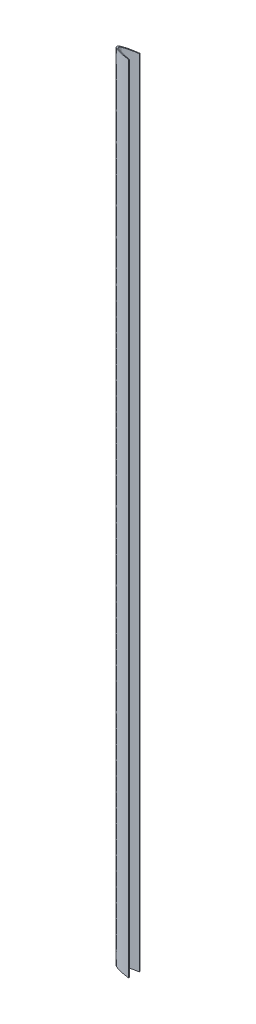
ISO-10303-21;
HEADER;
FILE_DESCRIPTION(('STEP AP214'),'2;1');
FILE_NAME('part.step','',(''),(''),'','','');
FILE_SCHEMA(('AUTOMOTIVE_DESIGN { 1 0 10303 214 1 1 1 1 }'));
ENDSEC;
DATA;
#1=APPLICATION_CONTEXT('core data for automotive mechanical design processes');
#2=APPLICATION_PROTOCOL_DEFINITION('international standard','automotive_design',2000,#1);
#3=PRODUCT_CONTEXT('',#1,'mechanical');
#4=PRODUCT('Part','Part','',(#3));
#5=PRODUCT_RELATED_PRODUCT_CATEGORY('part','',(#4));
#6=PRODUCT_DEFINITION_FORMATION('','',#4);
#7=PRODUCT_DEFINITION_CONTEXT('part definition',#1,'design');
#8=PRODUCT_DEFINITION('design','',#6,#7);
#9=PRODUCT_DEFINITION_SHAPE('','',#8);
#10=(LENGTH_UNIT() NAMED_UNIT(*) SI_UNIT(.MILLI.,.METRE.));
#11=(NAMED_UNIT(*) PLANE_ANGLE_UNIT() SI_UNIT($,.RADIAN.));
#12=(NAMED_UNIT(*) SI_UNIT($,.STERADIAN.) SOLID_ANGLE_UNIT());
#13=UNCERTAINTY_MEASURE_WITH_UNIT(LENGTH_MEASURE(1.E-05),#10,'distance_accuracy_value','');
#14=(GEOMETRIC_REPRESENTATION_CONTEXT(3) GLOBAL_UNCERTAINTY_ASSIGNED_CONTEXT((#13)) GLOBAL_UNIT_ASSIGNED_CONTEXT((#10,
#11,#12)) REPRESENTATION_CONTEXT('',''));
#15=CARTESIAN_POINT('',(0.,0.,0.));
#16=DIRECTION('',(0.,0.,1.));
#17=DIRECTION('',(1.,0.,0.));
#18=AXIS2_PLACEMENT_3D('',#15,#16,#17);
#19=CARTESIAN_POINT('',(189.415540071674,2000.,-1.46822710375217E-09));
#20=CARTESIAN_POINT('',(189.415509922383,2000.,-0.0373090774492106));
#21=CARTESIAN_POINT('',(187.234443709608,2000.,-0.185804178699002));
#22=CARTESIAN_POINT('',(185.009597589198,2000.,-0.522010603287973));
#23=CARTESIAN_POINT('',(180.540141212634,2000.,-1.07886918522139));
#24=CARTESIAN_POINT('',(175.979551932322,2000.,-2.00675916470342));
#25=CARTESIAN_POINT('',(169.923409393147,2000.,-3.42098479383916));
#26=CARTESIAN_POINT('',(162.292974670485,2000.,-5.28550112282938));
#27=CARTESIAN_POINT('',(153.26740712622,2000.,-7.61149253657733));
#28=CARTESIAN_POINT('',(144.244834339226,2000.,-9.87821380777125));
#29=CARTESIAN_POINT('',(135.21533799998,2000.,-11.968697988892));
#30=CARTESIAN_POINT('',(126.183269777046,2000.,-13.7603779795983));
#31=CARTESIAN_POINT('',(117.145069850987,2000.,-15.1633903003828));
#32=CARTESIAN_POINT('',(108.080251691055,2000.,-15.8345922202119));
#33=CARTESIAN_POINT('',(99.0364826373914,2000.,-16.2111416336134));
#34=CARTESIAN_POINT('',(89.9939333087765,2000.,-16.304571008796));
#35=CARTESIAN_POINT('',(80.9524002611325,2000.,-16.1623627831159));
#36=CARTESIAN_POINT('',(71.9106308540781,2000.,-15.7694412636075));
#37=CARTESIAN_POINT('',(62.8686421205967,2000.,-15.1279586655848));
#38=CARTESIAN_POINT('',(53.8245676436083,2000.,-14.2332421104154));
#39=CARTESIAN_POINT('',(44.7772746253797,2000.,-13.0460941768475));
#40=CARTESIAN_POINT('',(35.7197361057067,2000.,-11.5181357892432));
#41=CARTESIAN_POINT('',(28.1878138078091,2000.,-9.85311589432562));
#42=CARTESIAN_POINT('',(22.1769239605998,2000.,-8.18311409057811));
#43=CARTESIAN_POINT('',(17.6236293429938,2000.,-6.7114399364518));
#44=CARTESIAN_POINT('',(13.8437490033737,2000.,-5.16613162965056));
#45=CARTESIAN_POINT('',(11.2881346524485,2000.,-3.83325580592086));
#46=CARTESIAN_POINT('',(10.1187787372071,2000.,-2.96337889699919));
#47=CARTESIAN_POINT('',(9.38182237589285,2000.,-2.24956855700115));
#48=CARTESIAN_POINT('',(8.79999511200732,2000.,-1.30911098047793));
#49=CARTESIAN_POINT('',(8.57456595441904,2000.,1.30707810380218E-07));
#50=CARTESIAN_POINT('',(8.79999511392495,2000.,1.30911124156406));
#51=CARTESIAN_POINT('',(9.38182237918238,2000.,2.2495688172365));
#52=CARTESIAN_POINT('',(10.1187787415387,2000.,2.96337915615731));
#53=CARTESIAN_POINT('',(11.28813465805,2000.,3.83325606336938));
#54=CARTESIAN_POINT('',(13.8437490109283,2000.,5.16613188336316));
#55=CARTESIAN_POINT('',(17.6236293528016,2000.,6.7114401846392));
#56=CARTESIAN_POINT('',(22.1769239725582,2000.,8.18311433210913));
#57=CARTESIAN_POINT('',(28.1878138222133,2000.,9.85311612707132));
#58=CARTESIAN_POINT('',(35.7197361225358,2000.,11.5181360109671));
#59=CARTESIAN_POINT('',(44.7772746444777,2000.,13.0460943853815));
#60=CARTESIAN_POINT('',(53.8245676642928,2000.,14.2332423055379));
#61=CARTESIAN_POINT('',(62.8686421431529,2000.,15.1279588481782));
#62=CARTESIAN_POINT('',(71.9106308754901,2000.,15.7694414304118));
#63=CARTESIAN_POINT('',(80.9524002908713,2000.,16.1623629462799));
#64=CARTESIAN_POINT('',(89.9939333098195,2000.,16.3045711230417));
#65=CARTESIAN_POINT('',(99.0364827461727,2000.,16.2111418678867));
#66=CARTESIAN_POINT('',(108.08025139604,2000.,15.8345919431857));
#67=CARTESIAN_POINT('',(117.145071067495,2000.,15.1633918783438));
#68=CARTESIAN_POINT('',(126.183265287344,2000.,13.760372498588));
#69=CARTESIAN_POINT('',(135.215355049157,2000.,11.9687191026734));
#70=CARTESIAN_POINT('',(144.244770230589,2000.,9.87813466618072));
#71=CARTESIAN_POINT('',(153.267647716944,2000.,7.61178974984193));
#72=CARTESIAN_POINT('',(160.855089756957,2000.,5.65499039696558));
#73=CARTESIAN_POINT('',(166.875765087628,2000.,4.16754081835265));
#74=CARTESIAN_POINT('',(172.918491011001,2000.,2.71827606712224));
#75=CARTESIAN_POINT('',(178.782189930716,2000.,1.30435274576959));
#76=CARTESIAN_POINT('',(185.004045816921,2000.,0.521946489415346));
#77=CARTESIAN_POINT('',(187.234744008161,2000.,0.185808596921332));
#78=CARTESIAN_POINT('',(189.415570220964,2000.,0.0373090745127584));
#79=CARTESIAN_POINT('',(189.415540071674,2000.,-1.46822710375217E-09));
#80=B_SPLINE_CURVE_WITH_KNOTS('',3,(#19,#20,#21,#22,#23,#24,#25,#26,#27,#28,#29,#30,#31,#32,#33,
#34,#35,#36,#37,#38,#39,#40,#41,#42,#43,#44,#45,#46,#47,#48,#49,#50,#51,#52,#53,#54,#55,#56,#57,
#58,#59,#60,#61,#62,#63,#64,#65,#66,#67,#68,#69,#70,#71,#72,#73,#74,#75,#76,#77,#78,#79),
.UNSPECIFIED.,.T.,.F.,(4,1,1,1,1,1,1,1,1,1,1,1,1,1,1,1,1,1,1,1,1,1,1,1,1,1,1,1,1,1,1,1,1,1,1,1,
1,1,1,1,1,1,1,1,1,1,1,1,1,1,1,1,1,1,1,1,1,1,4),(0.,0.00275960006435719,0.0109837400285537,
0.0244798522244805,0.0359107304847873,0.0493053709513717,0.0742942270255699,0.0993429784245328,
0.124359733109855,0.149264718616297,0.174009696202119,0.198546973902352,0.222903969528019,
0.247200685918746,0.271477726499725,0.295756351635428,0.320054721145611,0.344391348740664,
0.368786978174677,0.393273071252745,0.417900952231735,0.4427812285463,0.455381891196595,
0.46816043628681,0.481314036541433,0.488255537630036,0.491307544737041,0.493017230715351,
0.496509376843066,0.500001654593551,0.503493932344035,0.50698607847175,0.50869576445006,
0.511747771557065,0.518689272645668,0.531842872900291,0.544621417990506,0.557222080640801,
0.582102356955366,0.606730237934356,0.631216331012424,0.655611960446438,0.67994858804149,
0.704246957551673,0.728525582687377,0.752802623268356,0.777099339659083,0.801456335284749,
0.825993612984982,0.850738590570804,0.875643576077246,0.900660330762568,0.925709082161531,
0.938746807311356,0.95069803514192,0.975520147775519,0.989016259971446,0.997240399935643,1.),.UNSPECIFIED.);
#81=DIRECTION('',(0.,-1.,0.));
#82=VECTOR('',#81,1.);
#83=SURFACE_OF_LINEAR_EXTRUSION('',#80,#82);
#84=CARTESIAN_POINT('',(189.415540071674,0.,-1.46822710375217E-09));
#85=CARTESIAN_POINT('',(189.415509922383,0.,-0.0373090774492106));
#86=CARTESIAN_POINT('',(187.234443709608,0.,-0.185804178699002));
#87=CARTESIAN_POINT('',(185.009597589198,0.,-0.522010603287973));
#88=CARTESIAN_POINT('',(180.540141212634,0.,-1.07886918522139));
#89=CARTESIAN_POINT('',(175.979551932322,0.,-2.00675916470342));
#90=CARTESIAN_POINT('',(169.923409393147,0.,-3.42098479383916));
#91=CARTESIAN_POINT('',(162.292974670485,0.,-5.28550112282938));
#92=CARTESIAN_POINT('',(153.26740712622,0.,-7.61149253657733));
#93=CARTESIAN_POINT('',(144.244834339226,0.,-9.87821380777125));
#94=CARTESIAN_POINT('',(135.21533799998,0.,-11.968697988892));
#95=CARTESIAN_POINT('',(126.183269777046,0.,-13.7603779795983));
#96=CARTESIAN_POINT('',(117.145069850987,0.,-15.1633903003828));
#97=CARTESIAN_POINT('',(108.080251691055,0.,-15.8345922202119));
#98=CARTESIAN_POINT('',(99.0364826373914,0.,-16.2111416336134));
#99=CARTESIAN_POINT('',(89.9939333087765,0.,-16.304571008796));
#100=CARTESIAN_POINT('',(80.9524002611325,0.,-16.1623627831159));
#101=CARTESIAN_POINT('',(71.9106308540781,0.,-15.7694412636075));
#102=CARTESIAN_POINT('',(62.8686421205967,0.,-15.1279586655848));
#103=CARTESIAN_POINT('',(53.8245676436083,0.,-14.2332421104154));
#104=CARTESIAN_POINT('',(44.7772746253797,0.,-13.0460941768475));
#105=CARTESIAN_POINT('',(35.7197361057067,0.,-11.5181357892432));
#106=CARTESIAN_POINT('',(28.1878138078091,0.,-9.85311589432562));
#107=CARTESIAN_POINT('',(22.1769239605998,0.,-8.18311409057811));
#108=CARTESIAN_POINT('',(17.6236293429938,0.,-6.7114399364518));
#109=CARTESIAN_POINT('',(13.8437490033737,0.,-5.16613162965056));
#110=CARTESIAN_POINT('',(11.2881346524485,0.,-3.83325580592086));
#111=CARTESIAN_POINT('',(10.1187787372071,0.,-2.96337889699919));
#112=CARTESIAN_POINT('',(9.38182237589285,0.,-2.24956855700115));
#113=CARTESIAN_POINT('',(8.79999511200732,0.,-1.30911098047793));
#114=CARTESIAN_POINT('',(8.57456595441904,0.,1.30707810380218E-07));
#115=CARTESIAN_POINT('',(8.79999511392495,0.,1.30911124156406));
#116=CARTESIAN_POINT('',(9.38182237918238,0.,2.2495688172365));
#117=CARTESIAN_POINT('',(10.1187787415387,0.,2.96337915615731));
#118=CARTESIAN_POINT('',(11.28813465805,0.,3.83325606336938));
#119=CARTESIAN_POINT('',(13.8437490109283,0.,5.16613188336316));
#120=CARTESIAN_POINT('',(17.6236293528016,0.,6.7114401846392));
#121=CARTESIAN_POINT('',(22.1769239725582,0.,8.18311433210913));
#122=CARTESIAN_POINT('',(28.1878138222133,0.,9.85311612707132));
#123=CARTESIAN_POINT('',(35.7197361225358,0.,11.5181360109671));
#124=CARTESIAN_POINT('',(44.7772746444777,0.,13.0460943853815));
#125=CARTESIAN_POINT('',(53.8245676642928,0.,14.2332423055379));
#126=CARTESIAN_POINT('',(62.8686421431529,0.,15.1279588481782));
#127=CARTESIAN_POINT('',(71.9106308754901,0.,15.7694414304118));
#128=CARTESIAN_POINT('',(80.9524002908713,0.,16.1623629462799));
#129=CARTESIAN_POINT('',(89.9939333098195,0.,16.3045711230417));
#130=CARTESIAN_POINT('',(99.0364827461727,0.,16.2111418678867));
#131=CARTESIAN_POINT('',(108.08025139604,0.,15.8345919431857));
#132=CARTESIAN_POINT('',(117.145071067495,0.,15.1633918783438));
#133=CARTESIAN_POINT('',(126.183265287344,0.,13.760372498588));
#134=CARTESIAN_POINT('',(135.215355049157,0.,11.9687191026734));
#135=CARTESIAN_POINT('',(144.244770230589,0.,9.87813466618072));
#136=CARTESIAN_POINT('',(153.267647716944,0.,7.61178974984193));
#137=CARTESIAN_POINT('',(160.855089756957,0.,5.65499039696558));
#138=CARTESIAN_POINT('',(166.875765087628,0.,4.16754081835265));
#139=CARTESIAN_POINT('',(172.918491011001,0.,2.71827606712224));
#140=CARTESIAN_POINT('',(178.782189930716,0.,1.30435274576959));
#141=CARTESIAN_POINT('',(185.004045816921,0.,0.521946489415346));
#142=CARTESIAN_POINT('',(187.234744008161,0.,0.185808596921332));
#143=CARTESIAN_POINT('',(189.415570220964,0.,0.0373090745127584));
#144=CARTESIAN_POINT('',(189.415540071674,0.,-1.46822710375217E-09));
#145=B_SPLINE_CURVE_WITH_KNOTS('',3,(#84,#85,#86,#87,#88,#89,#90,#91,#92,#93,#94,#95,#96,#97,
#98,#99,#100,#101,#102,#103,#104,#105,#106,#107,#108,#109,#110,#111,#112,#113,#114,#115,#116,
#117,#118,#119,#120,#121,#122,#123,#124,#125,#126,#127,#128,#129,#130,#131,#132,#133,#134,#135,
#136,#137,#138,#139,#140,#141,#142,#143,#144),.UNSPECIFIED.,.T.,.F.,(4,1,1,1,1,1,1,1,1,1,1,1,1,
1,1,1,1,1,1,1,1,1,1,1,1,1,1,1,1,1,1,1,1,1,1,1,1,1,1,1,1,1,1,1,1,1,1,1,1,1,1,1,1,1,1,1,1,1,4),
(0.,0.00275960006435719,0.0109837400285537,0.0244798522244805,0.0359107304847873,
0.0493053709513717,0.0742942270255699,0.0993429784245328,0.124359733109855,0.149264718616297,
0.174009696202119,0.198546973902352,0.222903969528019,0.247200685918746,0.271477726499725,
0.295756351635428,0.320054721145611,0.344391348740664,0.368786978174677,0.393273071252745,
0.417900952231735,0.4427812285463,0.455381891196595,0.46816043628681,0.481314036541433,
0.488255537630036,0.491307544737041,0.493017230715351,0.496509376843066,0.500001654593551,
0.503493932344035,0.50698607847175,0.50869576445006,0.511747771557065,0.518689272645668,
0.531842872900291,0.544621417990506,0.557222080640801,0.582102356955366,0.606730237934356,
0.631216331012424,0.655611960446438,0.67994858804149,0.704246957551673,0.728525582687377,
0.752802623268356,0.777099339659083,0.801456335284749,0.825993612984982,0.850738590570804,
0.875643576077246,0.900660330762568,0.925709082161531,0.938746807311356,0.95069803514192,
0.975520147775519,0.989016259971446,0.997240399935643,1.),.UNSPECIFIED.);
#146=CARTESIAN_POINT('',(52.4693522250673,0.,-14.0253387511073));
#147=VERTEX_POINT('',#146);
#148=CARTESIAN_POINT('',(52.4693522089367,0.,14.0253389439368));
#149=VERTEX_POINT('',#148);
#150=EDGE_CURVE('E129',#147,#149,#145,.T.);
#151=ORIENTED_EDGE('',*,*,#150,.T.);
#152=DIRECTION('',(0.,-1.,0.));
#153=VECTOR('',#152,1.);
#154=CARTESIAN_POINT('',(52.4693522089367,2000.,14.0253389439368));
#155=LINE('',#154,#153);
#156=CARTESIAN_POINT('',(52.4693522089367,2000.,14.0253389439368));
#157=VERTEX_POINT('',#156);
#158=EDGE_CURVE('E11',#157,#149,#155,.T.);
#159=ORIENTED_EDGE('',*,*,#158,.F.);
#160=CARTESIAN_POINT('',(52.4693522250673,2000.,-14.0253387511073));
#161=VERTEX_POINT('',#160);
#162=EDGE_CURVE('E90',#161,#157,#80,.T.);
#163=ORIENTED_EDGE('',*,*,#162,.F.);
#164=DIRECTION('',(0.,-1.,0.));
#165=VECTOR('',#164,1.);
#166=CARTESIAN_POINT('',(52.4693522250673,2000.,-14.0253387511073));
#167=LINE('',#166,#165);
#168=EDGE_CURVE('E59',#161,#147,#167,.T.);
#169=ORIENTED_EDGE('',*,*,#168,.T.);
#170=EDGE_LOOP('',(#151,#159,#163,#169));
#171=FACE_BOUND('',#170,.T.);
#172=ADVANCED_FACE('F41',(#171),#83,.F.);
#173=CARTESIAN_POINT('',(53.3899385658946,2000.,6.84688623850483));
#174=DIRECTION('',(0.991876925143201,0.,0.127201278957675));
#175=DIRECTION('',(0.127201278957675,0.,-0.991876925143201));
#176=AXIS2_PLACEMENT_3D('',#173,#174,#175);
#177=PLANE('',#176);
#178=DIRECTION('',(-0.127201278957675,0.,0.991876925143201));
#179=VECTOR('',#178,1.);
#180=CARTESIAN_POINT('',(53.3899385658946,0.,6.84688623850483));
#181=LINE('',#180,#179);
#182=CARTESIAN_POINT('',(52.6598819131393,0.,12.5396462001101));
#183=VERTEX_POINT('',#182);
#184=EDGE_CURVE('E134',#183,#149,#181,.T.);
#185=ORIENTED_EDGE('',*,*,#184,.F.);
#186=DIRECTION('',(0.,-1.,0.));
#187=VECTOR('',#186,1.);
#188=CARTESIAN_POINT('',(52.6598819131393,2000.,12.5396462001101));
#189=LINE('',#188,#187);
#190=CARTESIAN_POINT('',(52.6598819131393,2000.,12.5396462001101));
#191=VERTEX_POINT('',#190);
#192=EDGE_CURVE('E51',#191,#183,#189,.T.);
#193=ORIENTED_EDGE('',*,*,#192,.F.);
#194=DIRECTION('',(-0.127201278957675,0.,0.991876925143201));
#195=VECTOR('',#194,1.);
#196=CARTESIAN_POINT('',(53.3899385658946,2000.,6.84688623850483));
#197=LINE('',#196,#195);
#198=EDGE_CURVE('E183',#191,#157,#197,.T.);
#199=ORIENTED_EDGE('',*,*,#198,.T.);
#200=ORIENTED_EDGE('',*,*,#158,.T.);
#201=EDGE_LOOP('',(#185,#193,#199,#200));
#202=FACE_BOUND('',#201,.T.);
#203=ADVANCED_FACE('F166',(#202),#177,.T.);
#204=CARTESIAN_POINT('',(88.3455325932686,2000.,-221.758314387534));
#205=DIRECTION('',(0.,-1.,0.));
#206=DIRECTION('',(0.,0.,-1.));
#207=AXIS2_PLACEMENT_3D('',#204,#205,#206);
#208=CYLINDRICAL_SURFACE('',#207,236.999999999986);
#209=CARTESIAN_POINT('',(88.3455325932686,0.,-221.758314387534));
#210=DIRECTION('',(0.,1.,0.));
#211=DIRECTION('',(0.,0.,1.));
#212=AXIS2_PLACEMENT_3D('',#209,#210,#211);
#213=CIRCLE('',#212,236.999999999986);
#214=CARTESIAN_POINT('',(15.6180647821639,0.,3.8070096890584));
#215=VERTEX_POINT('',#214);
#216=EDGE_CURVE('E141',#215,#183,#213,.T.);
#217=ORIENTED_EDGE('',*,*,#216,.F.);
#218=DIRECTION('',(0.,-1.,0.));
#219=VECTOR('',#218,1.);
#220=CARTESIAN_POINT('',(15.6180647821639,2000.,3.8070096890584));
#221=LINE('',#220,#219);
#222=CARTESIAN_POINT('',(15.6180647821639,2000.,3.8070096890584));
#223=VERTEX_POINT('',#222);
#224=EDGE_CURVE('E111',#223,#215,#221,.T.);
#225=ORIENTED_EDGE('',*,*,#224,.F.);
#226=CARTESIAN_POINT('',(88.3455325932686,2000.,-221.758314387534));
#227=DIRECTION('',(0.,1.,0.));
#228=DIRECTION('',(0.,0.,1.));
#229=AXIS2_PLACEMENT_3D('',#226,#227,#228);
#230=CIRCLE('',#229,236.999999999986);
#231=EDGE_CURVE('E118',#223,#191,#230,.T.);
#232=ORIENTED_EDGE('',*,*,#231,.T.);
#233=ORIENTED_EDGE('',*,*,#192,.T.);
#234=EDGE_LOOP('',(#217,#225,#232,#233));
#235=FACE_BOUND('',#234,.T.);
#236=ADVANCED_FACE('F163',(#235),#208,.F.);
#237=CARTESIAN_POINT('',(16.845532593302,2000.,7.69958632160888E-12));
#238=DIRECTION('',(0.,-1.,0.));
#239=DIRECTION('',(0.,0.,-1.));
#240=AXIS2_PLACEMENT_3D('',#237,#238,#239);
#241=CYLINDRICAL_SURFACE('',#240,3.99999999998825);
#242=CARTESIAN_POINT('',(16.845532593302,0.,7.69958632160888E-12));
#243=DIRECTION('',(0.,1.,0.));
#244=DIRECTION('',(0.,0.,1.));
#245=AXIS2_PLACEMENT_3D('',#242,#243,#244);
#246=CIRCLE('',#245,3.99999999998825);
#247=CARTESIAN_POINT('',(15.6180647821552,0.,-3.80700968904018));
#248=VERTEX_POINT('',#247);
#249=EDGE_CURVE('E106',#248,#215,#246,.T.);
#250=ORIENTED_EDGE('',*,*,#249,.F.);
#251=DIRECTION('',(0.,-1.,0.));
#252=VECTOR('',#251,1.);
#253=CARTESIAN_POINT('',(15.6180647821552,2000.,-3.80700968904018));
#254=LINE('',#253,#252);
#255=CARTESIAN_POINT('',(15.6180647821552,2000.,-3.80700968904018));
#256=VERTEX_POINT('',#255);
#257=EDGE_CURVE('E101',#256,#248,#254,.T.);
#258=ORIENTED_EDGE('',*,*,#257,.F.);
#259=CARTESIAN_POINT('',(16.845532593302,2000.,7.69958632160888E-12));
#260=DIRECTION('',(0.,1.,0.));
#261=DIRECTION('',(0.,0.,1.));
#262=AXIS2_PLACEMENT_3D('',#259,#260,#261);
#263=CIRCLE('',#262,3.99999999998825);
#264=EDGE_CURVE('E104',#256,#223,#263,.T.);
#265=ORIENTED_EDGE('',*,*,#264,.T.);
#266=ORIENTED_EDGE('',*,*,#224,.T.);
#267=EDGE_LOOP('',(#250,#258,#265,#266));
#268=FACE_BOUND('',#267,.T.);
#269=ADVANCED_FACE('F103',(#268),#241,.F.);
#270=CARTESIAN_POINT('',(88.3455325933457,2000.,221.75831438755));
#271=DIRECTION('',(0.,-1.,0.));
#272=DIRECTION('',(0.,0.,-1.));
#273=AXIS2_PLACEMENT_3D('',#270,#271,#272);
#274=CYLINDRICAL_SURFACE('',#273,237.000000000007);
#275=CARTESIAN_POINT('',(88.3455325933457,0.,221.75831438755));
#276=DIRECTION('',(0.,1.,0.));
#277=DIRECTION('',(0.,0.,1.));
#278=AXIS2_PLACEMENT_3D('',#275,#276,#277);
#279=CIRCLE('',#278,237.000000000007);
#280=CARTESIAN_POINT('',(52.6478114143184,0.,-12.5378074382894));
#281=VERTEX_POINT('',#280);
#282=EDGE_CURVE('E147',#281,#248,#279,.T.);
#283=ORIENTED_EDGE('',*,*,#282,.F.);
#284=DIRECTION('',(0.,-1.,0.));
#285=VECTOR('',#284,1.);
#286=CARTESIAN_POINT('',(52.6478114143184,2000.,-12.5378074382894));
#287=LINE('',#286,#285);
#288=CARTESIAN_POINT('',(52.6478114143184,2000.,-12.5378074382894));
#289=VERTEX_POINT('',#288);
#290=EDGE_CURVE('E78',#289,#281,#287,.T.);
#291=ORIENTED_EDGE('',*,*,#290,.F.);
#292=CARTESIAN_POINT('',(88.3455325933457,2000.,221.75831438755));
#293=DIRECTION('',(0.,1.,0.));
#294=DIRECTION('',(0.,0.,1.));
#295=AXIS2_PLACEMENT_3D('',#292,#293,#294);
#296=CIRCLE('',#295,237.000000000007);
#297=EDGE_CURVE('E116',#289,#256,#296,.T.);
#298=ORIENTED_EDGE('',*,*,#297,.T.);
#299=ORIENTED_EDGE('',*,*,#257,.T.);
#300=EDGE_LOOP('',(#283,#291,#298,#299));
#301=FACE_BOUND('',#300,.T.);
#302=ADVANCED_FACE('F121',(#301),#274,.F.);
#303=CARTESIAN_POINT('',(53.3836321729996,2000.,-6.40443642078768));
#304=DIRECTION('',(0.992880357130684,0.,-0.119115894926097));
#305=DIRECTION('',(-0.119115894926097,0.,-0.992880357130684));
#306=AXIS2_PLACEMENT_3D('',#303,#304,#305);
#307=PLANE('',#306);
#308=DIRECTION('',(0.119115894926097,0.,0.992880357130684));
#309=VECTOR('',#308,1.);
#310=CARTESIAN_POINT('',(53.3836321729996,0.,-6.40443642078768));
#311=LINE('',#310,#309);
#312=EDGE_CURVE('E150',#147,#281,#311,.T.);
#313=ORIENTED_EDGE('',*,*,#312,.F.);
#314=ORIENTED_EDGE('',*,*,#168,.F.);
#315=DIRECTION('',(0.119115894926097,0.,0.992880357130684));
#316=VECTOR('',#315,1.);
#317=CARTESIAN_POINT('',(53.3836321729996,2000.,-6.40443642078768));
#318=LINE('',#317,#316);
#319=EDGE_CURVE('E123',#161,#289,#318,.T.);
#320=ORIENTED_EDGE('',*,*,#319,.T.);
#321=ORIENTED_EDGE('',*,*,#290,.T.);
#322=EDGE_LOOP('',(#313,#314,#320,#321));
#323=FACE_BOUND('',#322,.T.);
#324=ADVANCED_FACE('F169',(#323),#307,.T.);
#325=CARTESIAN_POINT('',(0.,2000.,0.));
#326=DIRECTION('',(0.,1.,0.));
#327=DIRECTION('',(0.,0.,1.));
#328=AXIS2_PLACEMENT_3D('',#325,#326,#327);
#329=PLANE('',#328);
#330=ORIENTED_EDGE('',*,*,#162,.T.);
#331=ORIENTED_EDGE('',*,*,#198,.F.);
#332=ORIENTED_EDGE('',*,*,#231,.F.);
#333=ORIENTED_EDGE('',*,*,#264,.F.);
#334=ORIENTED_EDGE('',*,*,#297,.F.);
#335=ORIENTED_EDGE('',*,*,#319,.F.);
#336=EDGE_LOOP('',(#330,#331,#332,#333,#334,#335));
#337=FACE_BOUND('',#336,.T.);
#338=ADVANCED_FACE('F115',(#337),#329,.T.);
#339=CARTESIAN_POINT('',(0.,0.,0.));
#340=DIRECTION('',(0.,1.,0.));
#341=DIRECTION('',(0.,0.,1.));
#342=AXIS2_PLACEMENT_3D('',#339,#340,#341);
#343=PLANE('',#342);
#344=ORIENTED_EDGE('',*,*,#150,.F.);
#345=ORIENTED_EDGE('',*,*,#312,.T.);
#346=ORIENTED_EDGE('',*,*,#282,.T.);
#347=ORIENTED_EDGE('',*,*,#249,.T.);
#348=ORIENTED_EDGE('',*,*,#216,.T.);
#349=ORIENTED_EDGE('',*,*,#184,.T.);
#350=EDGE_LOOP('',(#344,#345,#346,#347,#348,#349));
#351=FACE_BOUND('',#350,.T.);
#352=ADVANCED_FACE('F168',(#351),#343,.F.);
#353=CLOSED_SHELL('',(#172,#203,#236,#269,#302,#324,#338,#352));
#354=MANIFOLD_SOLID_BREP('B2',#353);
#355=ADVANCED_BREP_SHAPE_REPRESENTATION('',(#18,#354),#14);
#356=SHAPE_DEFINITION_REPRESENTATION(#9,#355);
ENDSEC;
END-ISO-10303-21;
